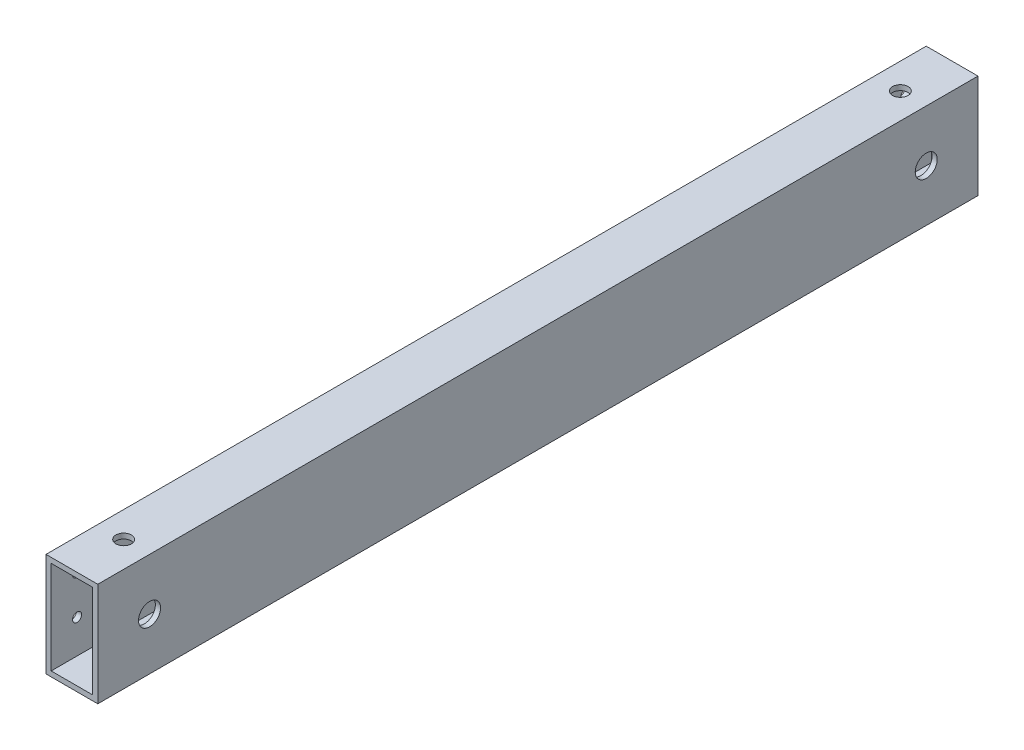
ISO-10303-21;
HEADER;
FILE_DESCRIPTION(('STEP AP214'),'2;1');
FILE_NAME('part.step','',(''),(''),'','','');
FILE_SCHEMA(('AUTOMOTIVE_DESIGN { 1 0 10303 214 1 1 1 1 }'));
ENDSEC;
DATA;
#1=APPLICATION_CONTEXT('core data for automotive mechanical design processes');
#2=APPLICATION_PROTOCOL_DEFINITION('international standard','automotive_design',2000,#1);
#3=PRODUCT_CONTEXT('',#1,'mechanical');
#4=PRODUCT('Part','Part','',(#3));
#5=PRODUCT_RELATED_PRODUCT_CATEGORY('part','',(#4));
#6=PRODUCT_DEFINITION_FORMATION('','',#4);
#7=PRODUCT_DEFINITION_CONTEXT('part definition',#1,'design');
#8=PRODUCT_DEFINITION('design','',#6,#7);
#9=PRODUCT_DEFINITION_SHAPE('','',#8);
#10=(LENGTH_UNIT() NAMED_UNIT(*) SI_UNIT(.MILLI.,.METRE.));
#11=(NAMED_UNIT(*) PLANE_ANGLE_UNIT() SI_UNIT($,.RADIAN.));
#12=(NAMED_UNIT(*) SI_UNIT($,.STERADIAN.) SOLID_ANGLE_UNIT());
#13=UNCERTAINTY_MEASURE_WITH_UNIT(LENGTH_MEASURE(1.E-05),#10,'distance_accuracy_value','');
#14=(GEOMETRIC_REPRESENTATION_CONTEXT(3) GLOBAL_UNCERTAINTY_ASSIGNED_CONTEXT((#13)) GLOBAL_UNIT_ASSIGNED_CONTEXT((#10,
#11,#12)) REPRESENTATION_CONTEXT('',''));
#15=CARTESIAN_POINT('',(0.,0.,0.));
#16=DIRECTION('',(0.,0.,1.));
#17=DIRECTION('',(1.,0.,0.));
#18=AXIS2_PLACEMENT_3D('',#15,#16,#17);
#19=CARTESIAN_POINT('',(0.,0.,340.));
#20=DIRECTION('',(0.,0.,-1.));
#21=DIRECTION('',(-1.,0.,0.));
#22=AXIS2_PLACEMENT_3D('',#19,#20,#21);
#23=PLANE('',#22);
#24=DIRECTION('',(0.,-1.,0.));
#25=VECTOR('',#24,1.);
#26=CARTESIAN_POINT('',(0.,0.,340.));
#27=LINE('',#26,#25);
#28=CARTESIAN_POINT('',(0.,40.,340.));
#29=VERTEX_POINT('',#28);
#30=CARTESIAN_POINT('',(0.,0.,340.));
#31=VERTEX_POINT('',#30);
#32=EDGE_CURVE('E136',#29,#31,#27,.T.);
#33=ORIENTED_EDGE('',*,*,#32,.T.);
#34=DIRECTION('',(1.,0.,0.));
#35=VECTOR('',#34,1.);
#36=CARTESIAN_POINT('',(0.,0.,340.));
#37=LINE('',#36,#35);
#38=CARTESIAN_POINT('',(20.,0.,340.));
#39=VERTEX_POINT('',#38);
#40=EDGE_CURVE('E139',#31,#39,#37,.T.);
#41=ORIENTED_EDGE('',*,*,#40,.T.);
#42=DIRECTION('',(0.,1.,0.));
#43=VECTOR('',#42,1.);
#44=CARTESIAN_POINT('',(20.,0.,340.));
#45=LINE('',#44,#43);
#46=CARTESIAN_POINT('',(20.,40.,340.));
#47=VERTEX_POINT('',#46);
#48=EDGE_CURVE('E142',#39,#47,#45,.T.);
#49=ORIENTED_EDGE('',*,*,#48,.T.);
#50=DIRECTION('',(-1.,0.,0.));
#51=VECTOR('',#50,1.);
#52=CARTESIAN_POINT('',(0.,40.,340.));
#53=LINE('',#52,#51);
#54=EDGE_CURVE('E144',#47,#29,#53,.T.);
#55=ORIENTED_EDGE('',*,*,#54,.T.);
#56=EDGE_LOOP('',(#33,#41,#49,#55));
#57=FACE_BOUND('',#56,.T.);
#58=DIRECTION('',(0.,-1.,0.));
#59=VECTOR('',#58,1.);
#60=CARTESIAN_POINT('',(2.,2.,340.));
#61=LINE('',#60,#59);
#62=CARTESIAN_POINT('',(2.,38.,340.));
#63=VERTEX_POINT('',#62);
#64=CARTESIAN_POINT('',(2.,2.,340.));
#65=VERTEX_POINT('',#64);
#66=EDGE_CURVE('E98',#63,#65,#61,.T.);
#67=ORIENTED_EDGE('',*,*,#66,.F.);
#68=DIRECTION('',(-1.,0.,0.));
#69=VECTOR('',#68,1.);
#70=CARTESIAN_POINT('',(2.,38.,340.));
#71=LINE('',#70,#69);
#72=CARTESIAN_POINT('',(18.,38.,340.));
#73=VERTEX_POINT('',#72);
#74=EDGE_CURVE('E120',#73,#63,#71,.T.);
#75=ORIENTED_EDGE('',*,*,#74,.F.);
#76=DIRECTION('',(0.,1.,0.));
#77=VECTOR('',#76,1.);
#78=CARTESIAN_POINT('',(18.,2.,340.));
#79=LINE('',#78,#77);
#80=CARTESIAN_POINT('',(18.,2.,340.));
#81=VERTEX_POINT('',#80);
#82=EDGE_CURVE('E118',#81,#73,#79,.T.);
#83=ORIENTED_EDGE('',*,*,#82,.F.);
#84=DIRECTION('',(1.,0.,0.));
#85=VECTOR('',#84,1.);
#86=CARTESIAN_POINT('',(2.,2.,340.));
#87=LINE('',#86,#85);
#88=EDGE_CURVE('E106',#65,#81,#87,.T.);
#89=ORIENTED_EDGE('',*,*,#88,.F.);
#90=EDGE_LOOP('',(#67,#75,#83,#89));
#91=FACE_BOUND('',#90,.T.);
#92=ADVANCED_FACE('F33',(#57,#91),#23,.F.);
#93=CARTESIAN_POINT('',(0.,0.,0.));
#94=DIRECTION('',(0.,0.,-1.));
#95=DIRECTION('',(-1.,0.,0.));
#96=AXIS2_PLACEMENT_3D('',#93,#94,#95);
#97=PLANE('',#96);
#98=DIRECTION('',(0.,-1.,0.));
#99=VECTOR('',#98,1.);
#100=CARTESIAN_POINT('',(0.,0.,0.));
#101=LINE('',#100,#99);
#102=CARTESIAN_POINT('',(0.,40.,0.));
#103=VERTEX_POINT('',#102);
#104=CARTESIAN_POINT('',(0.,0.,0.));
#105=VERTEX_POINT('',#104);
#106=EDGE_CURVE('E114',#103,#105,#101,.T.);
#107=ORIENTED_EDGE('',*,*,#106,.F.);
#108=DIRECTION('',(-1.,0.,0.));
#109=VECTOR('',#108,1.);
#110=CARTESIAN_POINT('',(0.,40.,0.));
#111=LINE('',#110,#109);
#112=CARTESIAN_POINT('',(20.,40.,0.));
#113=VERTEX_POINT('',#112);
#114=EDGE_CURVE('E140',#113,#103,#111,.T.);
#115=ORIENTED_EDGE('',*,*,#114,.F.);
#116=DIRECTION('',(0.,1.,0.));
#117=VECTOR('',#116,1.);
#118=CARTESIAN_POINT('',(20.,0.,0.));
#119=LINE('',#118,#117);
#120=CARTESIAN_POINT('',(20.,0.,0.));
#121=VERTEX_POINT('',#120);
#122=EDGE_CURVE('E151',#121,#113,#119,.T.);
#123=ORIENTED_EDGE('',*,*,#122,.F.);
#124=DIRECTION('',(1.,0.,0.));
#125=VECTOR('',#124,1.);
#126=CARTESIAN_POINT('',(0.,0.,0.));
#127=LINE('',#126,#125);
#128=EDGE_CURVE('E149',#105,#121,#127,.T.);
#129=ORIENTED_EDGE('',*,*,#128,.F.);
#130=EDGE_LOOP('',(#107,#115,#123,#129));
#131=FACE_BOUND('',#130,.T.);
#132=DIRECTION('',(-1.,0.,0.));
#133=VECTOR('',#132,1.);
#134=CARTESIAN_POINT('',(2.,38.,0.));
#135=LINE('',#134,#133);
#136=CARTESIAN_POINT('',(18.,38.,0.));
#137=VERTEX_POINT('',#136);
#138=CARTESIAN_POINT('',(2.,38.,0.));
#139=VERTEX_POINT('',#138);
#140=EDGE_CURVE('E107',#137,#139,#135,.T.);
#141=ORIENTED_EDGE('',*,*,#140,.T.);
#142=DIRECTION('',(0.,-1.,0.));
#143=VECTOR('',#142,1.);
#144=CARTESIAN_POINT('',(2.,2.,0.));
#145=LINE('',#144,#143);
#146=CARTESIAN_POINT('',(2.,2.,0.));
#147=VERTEX_POINT('',#146);
#148=EDGE_CURVE('E56',#139,#147,#145,.T.);
#149=ORIENTED_EDGE('',*,*,#148,.T.);
#150=DIRECTION('',(1.,0.,0.));
#151=VECTOR('',#150,1.);
#152=CARTESIAN_POINT('',(2.,2.,0.));
#153=LINE('',#152,#151);
#154=CARTESIAN_POINT('',(18.,2.,0.));
#155=VERTEX_POINT('',#154);
#156=EDGE_CURVE('E113',#147,#155,#153,.T.);
#157=ORIENTED_EDGE('',*,*,#156,.T.);
#158=DIRECTION('',(0.,1.,0.));
#159=VECTOR('',#158,1.);
#160=CARTESIAN_POINT('',(18.,2.,0.));
#161=LINE('',#160,#159);
#162=EDGE_CURVE('E128',#155,#137,#161,.T.);
#163=ORIENTED_EDGE('',*,*,#162,.T.);
#164=EDGE_LOOP('',(#141,#149,#157,#163));
#165=FACE_BOUND('',#164,.T.);
#166=ADVANCED_FACE('F169',(#131,#165),#97,.T.);
#167=CARTESIAN_POINT('',(0.,0.,340.));
#168=DIRECTION('',(1.,0.,0.));
#169=DIRECTION('',(0.,0.,-1.));
#170=AXIS2_PLACEMENT_3D('',#167,#168,#169);
#171=PLANE('',#170);
#172=CARTESIAN_POINT('',(0.,30.,330.));
#173=DIRECTION('',(-1.,0.,0.));
#174=DIRECTION('',(0.,0.,-1.));
#175=AXIS2_PLACEMENT_3D('',#172,#173,#174);
#176=CIRCLE('',#175,1.74999999999998);
#177=CARTESIAN_POINT('',(0.,30.,328.25));
#178=VERTEX_POINT('',#177);
#179=EDGE_CURVE('E264',#178,#178,#176,.T.);
#180=ORIENTED_EDGE('',*,*,#179,.F.);
#181=EDGE_LOOP('',(#180));
#182=FACE_BOUND('',#181,.T.);
#183=CARTESIAN_POINT('',(0.,15.,330.));
#184=DIRECTION('',(-1.,0.,0.));
#185=DIRECTION('',(0.,0.,-1.));
#186=AXIS2_PLACEMENT_3D('',#183,#184,#185);
#187=CIRCLE('',#186,1.74999999999998);
#188=CARTESIAN_POINT('',(0.,15.,328.25));
#189=VERTEX_POINT('',#188);
#190=EDGE_CURVE('E258',#189,#189,#187,.T.);
#191=ORIENTED_EDGE('',*,*,#190,.F.);
#192=EDGE_LOOP('',(#191));
#193=FACE_BOUND('',#192,.T.);
#194=CARTESIAN_POINT('',(0.,15.,285.));
#195=DIRECTION('',(-1.,0.,0.));
#196=DIRECTION('',(0.,0.,-1.));
#197=AXIS2_PLACEMENT_3D('',#194,#195,#196);
#198=CIRCLE('',#197,1.74999999999998);
#199=CARTESIAN_POINT('',(0.,15.,283.25));
#200=VERTEX_POINT('',#199);
#201=EDGE_CURVE('E252',#200,#200,#198,.T.);
#202=ORIENTED_EDGE('',*,*,#201,.F.);
#203=EDGE_LOOP('',(#202));
#204=FACE_BOUND('',#203,.T.);
#205=CARTESIAN_POINT('',(0.,15.,10.));
#206=DIRECTION('',(-1.,0.,0.));
#207=DIRECTION('',(0.,0.,1.));
#208=AXIS2_PLACEMENT_3D('',#205,#206,#207);
#209=CIRCLE('',#208,1.75);
#210=CARTESIAN_POINT('',(0.,15.,11.75));
#211=VERTEX_POINT('',#210);
#212=EDGE_CURVE('E242',#211,#211,#209,.T.);
#213=ORIENTED_EDGE('',*,*,#212,.F.);
#214=EDGE_LOOP('',(#213));
#215=FACE_BOUND('',#214,.T.);
#216=CARTESIAN_POINT('',(0.,15.,70.));
#217=DIRECTION('',(-1.,0.,0.));
#218=DIRECTION('',(0.,0.,1.));
#219=AXIS2_PLACEMENT_3D('',#216,#217,#218);
#220=CIRCLE('',#219,1.75);
#221=CARTESIAN_POINT('',(0.,15.,71.75));
#222=VERTEX_POINT('',#221);
#223=EDGE_CURVE('E227',#222,#222,#220,.T.);
#224=ORIENTED_EDGE('',*,*,#223,.F.);
#225=EDGE_LOOP('',(#224));
#226=FACE_BOUND('',#225,.T.);
#227=CARTESIAN_POINT('',(0.,15.,55.));
#228=DIRECTION('',(-1.,0.,0.));
#229=DIRECTION('',(0.,0.,1.));
#230=AXIS2_PLACEMENT_3D('',#227,#228,#229);
#231=CIRCLE('',#230,1.75);
#232=CARTESIAN_POINT('',(0.,15.,56.75));
#233=VERTEX_POINT('',#232);
#234=EDGE_CURVE('E228',#233,#233,#231,.T.);
#235=ORIENTED_EDGE('',*,*,#234,.F.);
#236=EDGE_LOOP('',(#235));
#237=FACE_BOUND('',#236,.T.);
#238=CARTESIAN_POINT('',(0.,15.,270.));
#239=DIRECTION('',(-1.,0.,0.));
#240=DIRECTION('',(0.,0.,-1.));
#241=AXIS2_PLACEMENT_3D('',#238,#239,#240);
#242=CIRCLE('',#241,1.74999999999998);
#243=CARTESIAN_POINT('',(0.,15.,268.25));
#244=VERTEX_POINT('',#243);
#245=EDGE_CURVE('E234',#244,#244,#242,.T.);
#246=ORIENTED_EDGE('',*,*,#245,.F.);
#247=EDGE_LOOP('',(#246));
#248=FACE_BOUND('',#247,.T.);
#249=CARTESIAN_POINT('',(0.,30.,10.));
#250=DIRECTION('',(-1.,0.,0.));
#251=DIRECTION('',(0.,0.,1.));
#252=AXIS2_PLACEMENT_3D('',#249,#250,#251);
#253=CIRCLE('',#252,1.75);
#254=CARTESIAN_POINT('',(0.,30.,11.75));
#255=VERTEX_POINT('',#254);
#256=EDGE_CURVE('E241',#255,#255,#253,.T.);
#257=ORIENTED_EDGE('',*,*,#256,.F.);
#258=EDGE_LOOP('',(#257));
#259=FACE_BOUND('',#258,.T.);
#260=ORIENTED_EDGE('',*,*,#106,.T.);
#261=DIRECTION('',(0.,0.,-1.));
#262=VECTOR('',#261,1.);
#263=CARTESIAN_POINT('',(0.,0.,340.));
#264=LINE('',#263,#262);
#265=EDGE_CURVE('E11',#31,#105,#264,.T.);
#266=ORIENTED_EDGE('',*,*,#265,.F.);
#267=ORIENTED_EDGE('',*,*,#32,.F.);
#268=DIRECTION('',(0.,0.,-1.));
#269=VECTOR('',#268,1.);
#270=CARTESIAN_POINT('',(0.,40.,340.));
#271=LINE('',#270,#269);
#272=EDGE_CURVE('E146',#29,#103,#271,.T.);
#273=ORIENTED_EDGE('',*,*,#272,.T.);
#274=EDGE_LOOP('',(#260,#266,#267,#273));
#275=FACE_BOUND('',#274,.T.);
#276=ADVANCED_FACE('F35',(#182,#193,#204,#215,#226,#237,#248,#259,#275),#171,.F.);
#277=CARTESIAN_POINT('',(0.,0.,340.));
#278=DIRECTION('',(0.,1.,0.));
#279=DIRECTION('',(0.,0.,1.));
#280=AXIS2_PLACEMENT_3D('',#277,#278,#279);
#281=PLANE('',#280);
#282=ORIENTED_EDGE('',*,*,#128,.T.);
#283=DIRECTION('',(0.,0.,-1.));
#284=VECTOR('',#283,1.);
#285=CARTESIAN_POINT('',(20.,0.,340.));
#286=LINE('',#285,#284);
#287=EDGE_CURVE('E41',#39,#121,#286,.T.);
#288=ORIENTED_EDGE('',*,*,#287,.F.);
#289=ORIENTED_EDGE('',*,*,#40,.F.);
#290=ORIENTED_EDGE('',*,*,#265,.T.);
#291=EDGE_LOOP('',(#282,#288,#289,#290));
#292=FACE_BOUND('',#291,.T.);
#293=ADVANCED_FACE('F179',(#292),#281,.F.);
#294=CARTESIAN_POINT('',(20.,0.,340.));
#295=DIRECTION('',(-1.,0.,0.));
#296=DIRECTION('',(0.,0.,1.));
#297=AXIS2_PLACEMENT_3D('',#294,#295,#296);
#298=PLANE('',#297);
#299=CARTESIAN_POINT('',(20.,20.,320.));
#300=DIRECTION('',(1.,0.,0.));
#301=DIRECTION('',(0.,0.,-1.));
#302=AXIS2_PLACEMENT_3D('',#299,#300,#301);
#303=CIRCLE('',#302,4.24999999999995);
#304=CARTESIAN_POINT('',(20.,20.,315.75));
#305=VERTEX_POINT('',#304);
#306=EDGE_CURVE('E220',#305,#305,#303,.T.);
#307=ORIENTED_EDGE('',*,*,#306,.F.);
#308=EDGE_LOOP('',(#307));
#309=FACE_BOUND('',#308,.T.);
#310=CARTESIAN_POINT('',(20.,20.,20.));
#311=DIRECTION('',(1.,0.,0.));
#312=DIRECTION('',(0.,0.,1.));
#313=AXIS2_PLACEMENT_3D('',#310,#311,#312);
#314=CIRCLE('',#313,4.25);
#315=CARTESIAN_POINT('',(20.,20.,24.25));
#316=VERTEX_POINT('',#315);
#317=EDGE_CURVE('E471',#316,#316,#314,.T.);
#318=ORIENTED_EDGE('',*,*,#317,.F.);
#319=EDGE_LOOP('',(#318));
#320=FACE_BOUND('',#319,.T.);
#321=ORIENTED_EDGE('',*,*,#122,.T.);
#322=DIRECTION('',(0.,0.,-1.));
#323=VECTOR('',#322,1.);
#324=CARTESIAN_POINT('',(20.,40.,340.));
#325=LINE('',#324,#323);
#326=EDGE_CURVE('E156',#47,#113,#325,.T.);
#327=ORIENTED_EDGE('',*,*,#326,.F.);
#328=ORIENTED_EDGE('',*,*,#48,.F.);
#329=ORIENTED_EDGE('',*,*,#287,.T.);
#330=EDGE_LOOP('',(#321,#327,#328,#329));
#331=FACE_BOUND('',#330,.T.);
#332=ADVANCED_FACE('F163',(#309,#320,#331),#298,.F.);
#333=CARTESIAN_POINT('',(0.,40.,340.));
#334=DIRECTION('',(0.,-1.,0.));
#335=DIRECTION('',(0.,0.,-1.));
#336=AXIS2_PLACEMENT_3D('',#333,#334,#335);
#337=PLANE('',#336);
#338=CARTESIAN_POINT('',(10.,40.,320.));
#339=DIRECTION('',(0.,1.,0.));
#340=DIRECTION('',(0.,0.,1.));
#341=AXIS2_PLACEMENT_3D('',#338,#339,#340);
#342=CIRCLE('',#341,3.);
#343=CARTESIAN_POINT('',(10.,40.,323.));
#344=VERTEX_POINT('',#343);
#345=EDGE_CURVE('E209',#344,#344,#342,.T.);
#346=ORIENTED_EDGE('',*,*,#345,.F.);
#347=EDGE_LOOP('',(#346));
#348=FACE_BOUND('',#347,.T.);
#349=CARTESIAN_POINT('',(10.,40.,20.));
#350=DIRECTION('',(0.,1.,0.));
#351=DIRECTION('',(0.,0.,-1.));
#352=AXIS2_PLACEMENT_3D('',#349,#350,#351);
#353=CIRCLE('',#352,3.);
#354=CARTESIAN_POINT('',(10.,40.,17.));
#355=VERTEX_POINT('',#354);
#356=EDGE_CURVE('E212',#355,#355,#353,.T.);
#357=ORIENTED_EDGE('',*,*,#356,.F.);
#358=EDGE_LOOP('',(#357));
#359=FACE_BOUND('',#358,.T.);
#360=ORIENTED_EDGE('',*,*,#114,.T.);
#361=ORIENTED_EDGE('',*,*,#272,.F.);
#362=ORIENTED_EDGE('',*,*,#54,.F.);
#363=ORIENTED_EDGE('',*,*,#326,.T.);
#364=EDGE_LOOP('',(#360,#361,#362,#363));
#365=FACE_BOUND('',#364,.T.);
#366=ADVANCED_FACE('F173',(#348,#359,#365),#337,.F.);
#367=CARTESIAN_POINT('',(2.,2.,340.));
#368=DIRECTION('',(1.,0.,0.));
#369=DIRECTION('',(0.,0.,-1.));
#370=AXIS2_PLACEMENT_3D('',#367,#368,#369);
#371=PLANE('',#370);
#372=CARTESIAN_POINT('',(2.,30.,330.));
#373=DIRECTION('',(-1.,0.,0.));
#374=DIRECTION('',(0.,0.,-1.));
#375=AXIS2_PLACEMENT_3D('',#372,#373,#374);
#376=CIRCLE('',#375,1.74999999999998);
#377=CARTESIAN_POINT('',(2.,30.,328.25));
#378=VERTEX_POINT('',#377);
#379=EDGE_CURVE('E261',#378,#378,#376,.T.);
#380=ORIENTED_EDGE('',*,*,#379,.T.);
#381=EDGE_LOOP('',(#380));
#382=FACE_BOUND('',#381,.T.);
#383=CARTESIAN_POINT('',(2.,15.,330.));
#384=DIRECTION('',(-1.,0.,0.));
#385=DIRECTION('',(0.,0.,-1.));
#386=AXIS2_PLACEMENT_3D('',#383,#384,#385);
#387=CIRCLE('',#386,1.74999999999998);
#388=CARTESIAN_POINT('',(2.,15.,328.25));
#389=VERTEX_POINT('',#388);
#390=EDGE_CURVE('E255',#389,#389,#387,.T.);
#391=ORIENTED_EDGE('',*,*,#390,.T.);
#392=EDGE_LOOP('',(#391));
#393=FACE_BOUND('',#392,.T.);
#394=CARTESIAN_POINT('',(2.,15.,285.));
#395=DIRECTION('',(-1.,0.,0.));
#396=DIRECTION('',(0.,0.,-1.));
#397=AXIS2_PLACEMENT_3D('',#394,#395,#396);
#398=CIRCLE('',#397,1.74999999999998);
#399=CARTESIAN_POINT('',(2.,15.,283.25));
#400=VERTEX_POINT('',#399);
#401=EDGE_CURVE('E237',#400,#400,#398,.T.);
#402=ORIENTED_EDGE('',*,*,#401,.T.);
#403=EDGE_LOOP('',(#402));
#404=FACE_BOUND('',#403,.T.);
#405=CARTESIAN_POINT('',(2.,15.,10.));
#406=DIRECTION('',(-1.,0.,0.));
#407=DIRECTION('',(0.,0.,1.));
#408=AXIS2_PLACEMENT_3D('',#405,#406,#407);
#409=CIRCLE('',#408,1.75);
#410=CARTESIAN_POINT('',(2.,15.,11.75));
#411=VERTEX_POINT('',#410);
#412=EDGE_CURVE('E238',#411,#411,#409,.T.);
#413=ORIENTED_EDGE('',*,*,#412,.T.);
#414=EDGE_LOOP('',(#413));
#415=FACE_BOUND('',#414,.T.);
#416=CARTESIAN_POINT('',(2.,15.,70.));
#417=DIRECTION('',(-1.,0.,0.));
#418=DIRECTION('',(0.,0.,1.));
#419=AXIS2_PLACEMENT_3D('',#416,#417,#418);
#420=CIRCLE('',#419,1.75);
#421=CARTESIAN_POINT('',(2.,15.,71.75));
#422=VERTEX_POINT('',#421);
#423=EDGE_CURVE('E245',#422,#422,#420,.T.);
#424=ORIENTED_EDGE('',*,*,#423,.T.);
#425=EDGE_LOOP('',(#424));
#426=FACE_BOUND('',#425,.T.);
#427=CARTESIAN_POINT('',(2.,15.,55.));
#428=DIRECTION('',(-1.,0.,0.));
#429=DIRECTION('',(0.,0.,1.));
#430=AXIS2_PLACEMENT_3D('',#427,#428,#429);
#431=CIRCLE('',#430,1.75);
#432=CARTESIAN_POINT('',(2.,15.,56.75));
#433=VERTEX_POINT('',#432);
#434=EDGE_CURVE('E224',#433,#433,#431,.T.);
#435=ORIENTED_EDGE('',*,*,#434,.T.);
#436=EDGE_LOOP('',(#435));
#437=FACE_BOUND('',#436,.T.);
#438=CARTESIAN_POINT('',(2.,15.,270.));
#439=DIRECTION('',(-1.,0.,0.));
#440=DIRECTION('',(0.,0.,-1.));
#441=AXIS2_PLACEMENT_3D('',#438,#439,#440);
#442=CIRCLE('',#441,1.74999999999998);
#443=CARTESIAN_POINT('',(2.,15.,268.25));
#444=VERTEX_POINT('',#443);
#445=EDGE_CURVE('E231',#444,#444,#442,.T.);
#446=ORIENTED_EDGE('',*,*,#445,.T.);
#447=EDGE_LOOP('',(#446));
#448=FACE_BOUND('',#447,.T.);
#449=CARTESIAN_POINT('',(2.,30.,10.));
#450=DIRECTION('',(-1.,0.,0.));
#451=DIRECTION('',(0.,0.,1.));
#452=AXIS2_PLACEMENT_3D('',#449,#450,#451);
#453=CIRCLE('',#452,1.75);
#454=CARTESIAN_POINT('',(2.,30.,11.75));
#455=VERTEX_POINT('',#454);
#456=EDGE_CURVE('E126',#455,#455,#453,.T.);
#457=ORIENTED_EDGE('',*,*,#456,.T.);
#458=EDGE_LOOP('',(#457));
#459=FACE_BOUND('',#458,.T.);
#460=ORIENTED_EDGE('',*,*,#148,.F.);
#461=DIRECTION('',(0.,0.,-1.));
#462=VECTOR('',#461,1.);
#463=CARTESIAN_POINT('',(2.,38.,340.));
#464=LINE('',#463,#462);
#465=EDGE_CURVE('E102',#63,#139,#464,.T.);
#466=ORIENTED_EDGE('',*,*,#465,.F.);
#467=ORIENTED_EDGE('',*,*,#66,.T.);
#468=DIRECTION('',(0.,0.,-1.));
#469=VECTOR('',#468,1.);
#470=CARTESIAN_POINT('',(2.,2.,340.));
#471=LINE('',#470,#469);
#472=EDGE_CURVE('E101',#65,#147,#471,.T.);
#473=ORIENTED_EDGE('',*,*,#472,.T.);
#474=EDGE_LOOP('',(#460,#466,#467,#473));
#475=FACE_BOUND('',#474,.T.);
#476=ADVANCED_FACE('F100',(#382,#393,#404,#415,#426,#437,#448,#459,#475),#371,.T.);
#477=CARTESIAN_POINT('',(2.,2.,340.));
#478=DIRECTION('',(0.,1.,0.));
#479=DIRECTION('',(0.,0.,1.));
#480=AXIS2_PLACEMENT_3D('',#477,#478,#479);
#481=PLANE('',#480);
#482=ORIENTED_EDGE('',*,*,#156,.F.);
#483=ORIENTED_EDGE('',*,*,#472,.F.);
#484=ORIENTED_EDGE('',*,*,#88,.T.);
#485=DIRECTION('',(0.,0.,-1.));
#486=VECTOR('',#485,1.);
#487=CARTESIAN_POINT('',(18.,2.,340.));
#488=LINE('',#487,#486);
#489=EDGE_CURVE('E115',#81,#155,#488,.T.);
#490=ORIENTED_EDGE('',*,*,#489,.T.);
#491=EDGE_LOOP('',(#482,#483,#484,#490));
#492=FACE_BOUND('',#491,.T.);
#493=ADVANCED_FACE('F110',(#492),#481,.T.);
#494=CARTESIAN_POINT('',(18.,2.,340.));
#495=DIRECTION('',(-1.,0.,0.));
#496=DIRECTION('',(0.,0.,1.));
#497=AXIS2_PLACEMENT_3D('',#494,#495,#496);
#498=PLANE('',#497);
#499=CARTESIAN_POINT('',(18.,20.,320.));
#500=DIRECTION('',(1.,0.,0.));
#501=DIRECTION('',(0.,0.,-1.));
#502=AXIS2_PLACEMENT_3D('',#499,#500,#501);
#503=CIRCLE('',#502,4.24999999999995);
#504=CARTESIAN_POINT('',(18.,20.,315.75));
#505=VERTEX_POINT('',#504);
#506=EDGE_CURVE('E215',#505,#505,#503,.T.);
#507=ORIENTED_EDGE('',*,*,#506,.T.);
#508=EDGE_LOOP('',(#507));
#509=FACE_BOUND('',#508,.T.);
#510=CARTESIAN_POINT('',(18.,20.,20.));
#511=DIRECTION('',(1.,0.,0.));
#512=DIRECTION('',(0.,0.,1.));
#513=AXIS2_PLACEMENT_3D('',#510,#511,#512);
#514=CIRCLE('',#513,4.25);
#515=CARTESIAN_POINT('',(18.,20.,24.25));
#516=VERTEX_POINT('',#515);
#517=EDGE_CURVE('E468',#516,#516,#514,.T.);
#518=ORIENTED_EDGE('',*,*,#517,.T.);
#519=EDGE_LOOP('',(#518));
#520=FACE_BOUND('',#519,.T.);
#521=ORIENTED_EDGE('',*,*,#162,.F.);
#522=ORIENTED_EDGE('',*,*,#489,.F.);
#523=ORIENTED_EDGE('',*,*,#82,.T.);
#524=DIRECTION('',(0.,0.,-1.));
#525=VECTOR('',#524,1.);
#526=CARTESIAN_POINT('',(18.,38.,340.));
#527=LINE('',#526,#525);
#528=EDGE_CURVE('E48',#73,#137,#527,.T.);
#529=ORIENTED_EDGE('',*,*,#528,.T.);
#530=EDGE_LOOP('',(#521,#522,#523,#529));
#531=FACE_BOUND('',#530,.T.);
#532=ADVANCED_FACE('F286',(#509,#520,#531),#498,.T.);
#533=CARTESIAN_POINT('',(2.,38.,340.));
#534=DIRECTION('',(0.,-1.,0.));
#535=DIRECTION('',(0.,0.,-1.));
#536=AXIS2_PLACEMENT_3D('',#533,#534,#535);
#537=PLANE('',#536);
#538=CARTESIAN_POINT('',(10.,38.,320.));
#539=DIRECTION('',(0.,1.,0.));
#540=DIRECTION('',(0.,0.,1.));
#541=AXIS2_PLACEMENT_3D('',#538,#539,#540);
#542=CIRCLE('',#541,3.);
#543=CARTESIAN_POINT('',(10.,38.,323.));
#544=VERTEX_POINT('',#543);
#545=EDGE_CURVE('E267',#544,#544,#542,.T.);
#546=ORIENTED_EDGE('',*,*,#545,.T.);
#547=EDGE_LOOP('',(#546));
#548=FACE_BOUND('',#547,.T.);
#549=CARTESIAN_POINT('',(10.,38.,20.));
#550=DIRECTION('',(0.,1.,0.));
#551=DIRECTION('',(0.,0.,-1.));
#552=AXIS2_PLACEMENT_3D('',#549,#550,#551);
#553=CIRCLE('',#552,3.);
#554=CARTESIAN_POINT('',(10.,38.,17.));
#555=VERTEX_POINT('',#554);
#556=EDGE_CURVE('E214',#555,#555,#553,.T.);
#557=ORIENTED_EDGE('',*,*,#556,.T.);
#558=EDGE_LOOP('',(#557));
#559=FACE_BOUND('',#558,.T.);
#560=ORIENTED_EDGE('',*,*,#140,.F.);
#561=ORIENTED_EDGE('',*,*,#528,.F.);
#562=ORIENTED_EDGE('',*,*,#74,.T.);
#563=ORIENTED_EDGE('',*,*,#465,.T.);
#564=EDGE_LOOP('',(#560,#561,#562,#563));
#565=FACE_BOUND('',#564,.T.);
#566=ADVANCED_FACE('F276',(#548,#559,#565),#537,.T.);
#567=CARTESIAN_POINT('',(2.,30.,10.));
#568=DIRECTION('',(-1.,0.,0.));
#569=DIRECTION('',(0.,0.,1.));
#570=AXIS2_PLACEMENT_3D('',#567,#568,#569);
#571=CYLINDRICAL_SURFACE('',#570,1.75);
#572=ORIENTED_EDGE('',*,*,#456,.F.);
#573=EDGE_LOOP('',(#572));
#574=FACE_BOUND('',#573,.T.);
#575=ORIENTED_EDGE('',*,*,#256,.T.);
#576=EDGE_LOOP('',(#575));
#577=FACE_BOUND('',#576,.T.);
#578=ADVANCED_FACE('F272',(#574,#577),#571,.F.);
#579=CARTESIAN_POINT('',(2.,15.,270.));
#580=DIRECTION('',(-1.,0.,0.));
#581=DIRECTION('',(0.,0.,1.));
#582=AXIS2_PLACEMENT_3D('',#579,#580,#581);
#583=CYLINDRICAL_SURFACE('',#582,1.74999999999998);
#584=ORIENTED_EDGE('',*,*,#445,.F.);
#585=EDGE_LOOP('',(#584));
#586=FACE_BOUND('',#585,.T.);
#587=ORIENTED_EDGE('',*,*,#245,.T.);
#588=EDGE_LOOP('',(#587));
#589=FACE_BOUND('',#588,.T.);
#590=ADVANCED_FACE('F275',(#586,#589),#583,.F.);
#591=CARTESIAN_POINT('',(2.,15.,55.));
#592=DIRECTION('',(-1.,0.,0.));
#593=DIRECTION('',(0.,0.,1.));
#594=AXIS2_PLACEMENT_3D('',#591,#592,#593);
#595=CYLINDRICAL_SURFACE('',#594,1.75);
#596=ORIENTED_EDGE('',*,*,#434,.F.);
#597=EDGE_LOOP('',(#596));
#598=FACE_BOUND('',#597,.T.);
#599=ORIENTED_EDGE('',*,*,#234,.T.);
#600=EDGE_LOOP('',(#599));
#601=FACE_BOUND('',#600,.T.);
#602=ADVANCED_FACE('F283',(#598,#601),#595,.F.);
#603=CARTESIAN_POINT('',(2.,15.,70.));
#604=DIRECTION('',(-1.,0.,0.));
#605=DIRECTION('',(0.,0.,1.));
#606=AXIS2_PLACEMENT_3D('',#603,#604,#605);
#607=CYLINDRICAL_SURFACE('',#606,1.75);
#608=ORIENTED_EDGE('',*,*,#423,.F.);
#609=EDGE_LOOP('',(#608));
#610=FACE_BOUND('',#609,.T.);
#611=ORIENTED_EDGE('',*,*,#223,.T.);
#612=EDGE_LOOP('',(#611));
#613=FACE_BOUND('',#612,.T.);
#614=ADVANCED_FACE('F374',(#610,#613),#607,.F.);
#615=CARTESIAN_POINT('',(2.,15.,10.));
#616=DIRECTION('',(-1.,0.,0.));
#617=DIRECTION('',(0.,0.,1.));
#618=AXIS2_PLACEMENT_3D('',#615,#616,#617);
#619=CYLINDRICAL_SURFACE('',#618,1.75);
#620=ORIENTED_EDGE('',*,*,#412,.F.);
#621=EDGE_LOOP('',(#620));
#622=FACE_BOUND('',#621,.T.);
#623=ORIENTED_EDGE('',*,*,#212,.T.);
#624=EDGE_LOOP('',(#623));
#625=FACE_BOUND('',#624,.T.);
#626=ADVANCED_FACE('F384',(#622,#625),#619,.F.);
#627=CARTESIAN_POINT('',(2.,15.,285.));
#628=DIRECTION('',(-1.,0.,0.));
#629=DIRECTION('',(0.,0.,1.));
#630=AXIS2_PLACEMENT_3D('',#627,#628,#629);
#631=CYLINDRICAL_SURFACE('',#630,1.74999999999998);
#632=ORIENTED_EDGE('',*,*,#401,.F.);
#633=EDGE_LOOP('',(#632));
#634=FACE_BOUND('',#633,.T.);
#635=ORIENTED_EDGE('',*,*,#201,.T.);
#636=EDGE_LOOP('',(#635));
#637=FACE_BOUND('',#636,.T.);
#638=ADVANCED_FACE('F394',(#634,#637),#631,.F.);
#639=CARTESIAN_POINT('',(2.,15.,330.));
#640=DIRECTION('',(-1.,0.,0.));
#641=DIRECTION('',(0.,0.,1.));
#642=AXIS2_PLACEMENT_3D('',#639,#640,#641);
#643=CYLINDRICAL_SURFACE('',#642,1.74999999999998);
#644=ORIENTED_EDGE('',*,*,#390,.F.);
#645=EDGE_LOOP('',(#644));
#646=FACE_BOUND('',#645,.T.);
#647=ORIENTED_EDGE('',*,*,#190,.T.);
#648=EDGE_LOOP('',(#647));
#649=FACE_BOUND('',#648,.T.);
#650=ADVANCED_FACE('F404',(#646,#649),#643,.F.);
#651=CARTESIAN_POINT('',(2.,30.,330.));
#652=DIRECTION('',(-1.,0.,0.));
#653=DIRECTION('',(0.,0.,1.));
#654=AXIS2_PLACEMENT_3D('',#651,#652,#653);
#655=CYLINDRICAL_SURFACE('',#654,1.74999999999998);
#656=ORIENTED_EDGE('',*,*,#379,.F.);
#657=EDGE_LOOP('',(#656));
#658=FACE_BOUND('',#657,.T.);
#659=ORIENTED_EDGE('',*,*,#179,.T.);
#660=EDGE_LOOP('',(#659));
#661=FACE_BOUND('',#660,.T.);
#662=ADVANCED_FACE('F291',(#658,#661),#655,.F.);
#663=CARTESIAN_POINT('',(10.,38.,20.));
#664=DIRECTION('',(0.,1.,0.));
#665=DIRECTION('',(0.,0.,1.));
#666=AXIS2_PLACEMENT_3D('',#663,#664,#665);
#667=CYLINDRICAL_SURFACE('',#666,3.);
#668=ORIENTED_EDGE('',*,*,#556,.F.);
#669=EDGE_LOOP('',(#668));
#670=FACE_BOUND('',#669,.T.);
#671=ORIENTED_EDGE('',*,*,#356,.T.);
#672=EDGE_LOOP('',(#671));
#673=FACE_BOUND('',#672,.T.);
#674=ADVANCED_FACE('F318',(#670,#673),#667,.F.);
#675=CARTESIAN_POINT('',(10.,38.,320.));
#676=DIRECTION('',(0.,1.,0.));
#677=DIRECTION('',(0.,0.,1.));
#678=AXIS2_PLACEMENT_3D('',#675,#676,#677);
#679=CYLINDRICAL_SURFACE('',#678,3.);
#680=ORIENTED_EDGE('',*,*,#545,.F.);
#681=EDGE_LOOP('',(#680));
#682=FACE_BOUND('',#681,.T.);
#683=ORIENTED_EDGE('',*,*,#345,.T.);
#684=EDGE_LOOP('',(#683));
#685=FACE_BOUND('',#684,.T.);
#686=ADVANCED_FACE('F323',(#682,#685),#679,.F.);
#687=CARTESIAN_POINT('',(18.,20.,20.));
#688=DIRECTION('',(1.,0.,0.));
#689=DIRECTION('',(0.,0.,-1.));
#690=AXIS2_PLACEMENT_3D('',#687,#688,#689);
#691=CYLINDRICAL_SURFACE('',#690,4.25);
#692=ORIENTED_EDGE('',*,*,#517,.F.);
#693=EDGE_LOOP('',(#692));
#694=FACE_BOUND('',#693,.T.);
#695=ORIENTED_EDGE('',*,*,#317,.T.);
#696=EDGE_LOOP('',(#695));
#697=FACE_BOUND('',#696,.T.);
#698=ADVANCED_FACE('F334',(#694,#697),#691,.F.);
#699=CARTESIAN_POINT('',(18.,20.,320.));
#700=DIRECTION('',(1.,0.,0.));
#701=DIRECTION('',(0.,0.,-1.));
#702=AXIS2_PLACEMENT_3D('',#699,#700,#701);
#703=CYLINDRICAL_SURFACE('',#702,4.24999999999995);
#704=ORIENTED_EDGE('',*,*,#506,.F.);
#705=EDGE_LOOP('',(#704));
#706=FACE_BOUND('',#705,.T.);
#707=ORIENTED_EDGE('',*,*,#306,.T.);
#708=EDGE_LOOP('',(#707));
#709=FACE_BOUND('',#708,.T.);
#710=ADVANCED_FACE('F458',(#706,#709),#703,.F.);
#711=CLOSED_SHELL('',(#92,#166,#276,#293,#332,#366,#476,#493,#532,#566,#578,#590,#602,#614,#626,
#638,#650,#662,#674,#686,#698,#710));
#712=MANIFOLD_SOLID_BREP('B2',#711);
#713=ADVANCED_BREP_SHAPE_REPRESENTATION('',(#18,#712),#14);
#714=SHAPE_DEFINITION_REPRESENTATION(#9,#713);
ENDSEC;
END-ISO-10303-21;
